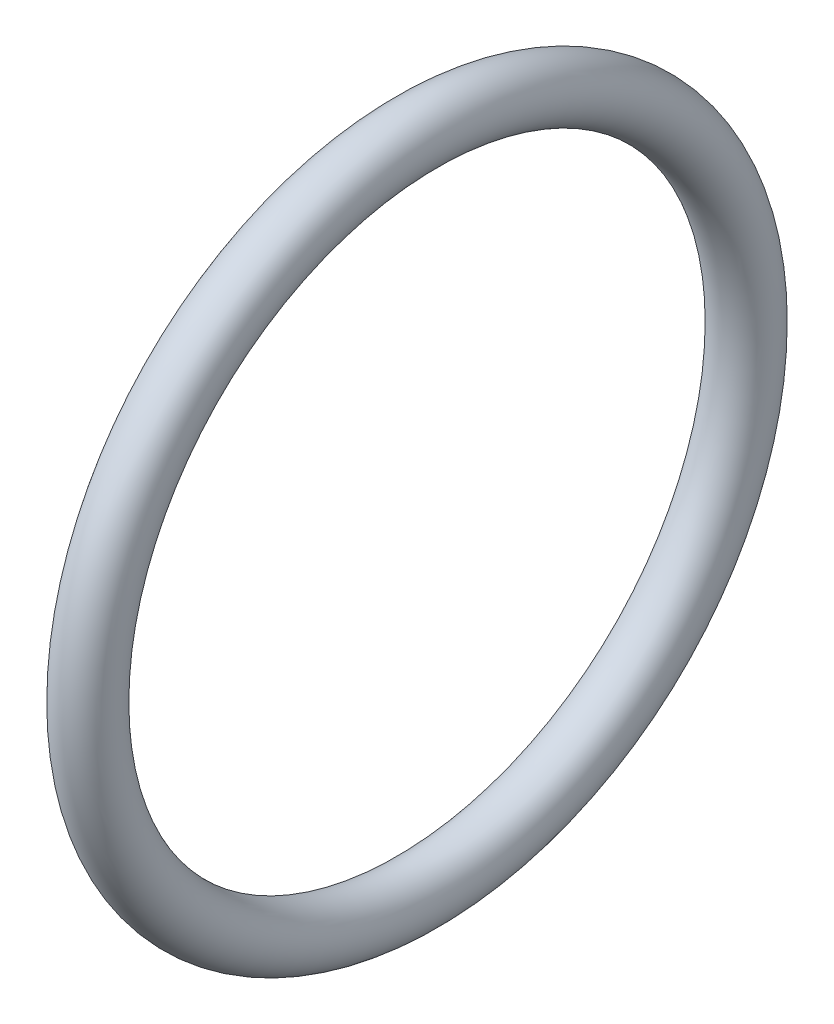
ISO-10303-21;
HEADER;
FILE_DESCRIPTION(('STEP AP214'),'2;1');
FILE_NAME('part.step','',(''),(''),'','','');
FILE_SCHEMA(('AUTOMOTIVE_DESIGN { 1 0 10303 214 1 1 1 1 }'));
ENDSEC;
DATA;
#1=APPLICATION_CONTEXT('core data for automotive mechanical design processes');
#2=APPLICATION_PROTOCOL_DEFINITION('international standard','automotive_design',2000,#1);
#3=PRODUCT_CONTEXT('',#1,'mechanical');
#4=PRODUCT('Part','Part','',(#3));
#5=PRODUCT_RELATED_PRODUCT_CATEGORY('part','',(#4));
#6=PRODUCT_DEFINITION_FORMATION('','',#4);
#7=PRODUCT_DEFINITION_CONTEXT('part definition',#1,'design');
#8=PRODUCT_DEFINITION('design','',#6,#7);
#9=PRODUCT_DEFINITION_SHAPE('','',#8);
#10=(LENGTH_UNIT() NAMED_UNIT(*) SI_UNIT(.MILLI.,.METRE.));
#11=(NAMED_UNIT(*) PLANE_ANGLE_UNIT() SI_UNIT($,.RADIAN.));
#12=(NAMED_UNIT(*) SI_UNIT($,.STERADIAN.) SOLID_ANGLE_UNIT());
#13=UNCERTAINTY_MEASURE_WITH_UNIT(LENGTH_MEASURE(1.E-05),#10,'distance_accuracy_value','');
#14=(GEOMETRIC_REPRESENTATION_CONTEXT(3) GLOBAL_UNCERTAINTY_ASSIGNED_CONTEXT((#13)) GLOBAL_UNIT_ASSIGNED_CONTEXT((#10,
#11,#12)) REPRESENTATION_CONTEXT('',''));
#15=CARTESIAN_POINT('',(0.,0.,0.));
#16=DIRECTION('',(0.,0.,1.));
#17=DIRECTION('',(1.,0.,0.));
#18=AXIS2_PLACEMENT_3D('',#15,#16,#17);
#19=CARTESIAN_POINT('',(0.,0.,0.));
#20=DIRECTION('',(-1.,0.,0.));
#21=DIRECTION('',(0.,0.,1.));
#22=AXIS2_PLACEMENT_3D('',#19,#20,#21);
#23=TOROIDAL_SURFACE('',#22,18.,1.5875);
#24=CARTESIAN_POINT('',(0.,0.,19.5875));
#25=VERTEX_POINT('',#24);
#26=VERTEX_LOOP('',#25);
#27=FACE_BOUND('',#26,.T.);
#28=ADVANCED_FACE('F30',(#27),#23,.T.);
#29=CLOSED_SHELL('',(#28));
#30=MANIFOLD_SOLID_BREP('B2',#29);
#31=ADVANCED_BREP_SHAPE_REPRESENTATION('',(#18,#30),#14);
#32=SHAPE_DEFINITION_REPRESENTATION(#9,#31);
ENDSEC;
END-ISO-10303-21;
